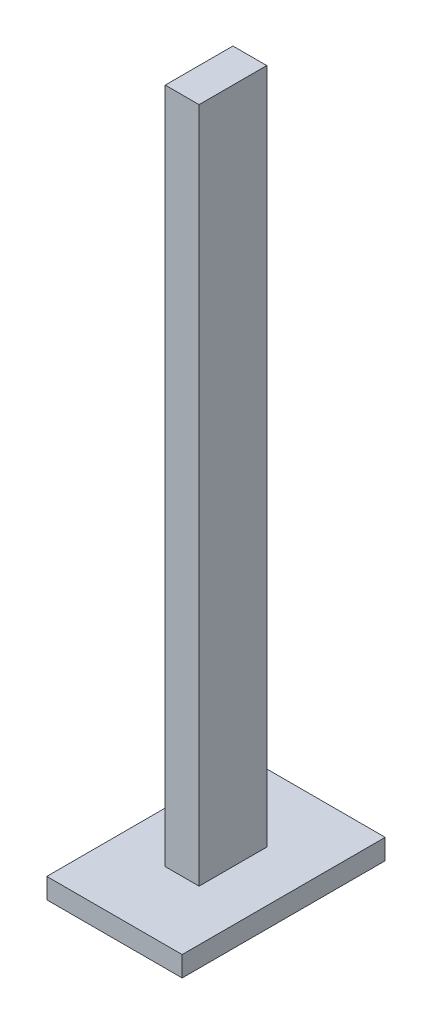
ISO-10303-21;
HEADER;
FILE_DESCRIPTION(('STEP AP214'),'2;1');
FILE_NAME('part.step','',(''),(''),'','','');
FILE_SCHEMA(('AUTOMOTIVE_DESIGN { 1 0 10303 214 1 1 1 1 }'));
ENDSEC;
DATA;
#1=APPLICATION_CONTEXT('core data for automotive mechanical design processes');
#2=APPLICATION_PROTOCOL_DEFINITION('international standard','automotive_design',2000,#1);
#3=PRODUCT_CONTEXT('',#1,'mechanical');
#4=PRODUCT('Part','Part','',(#3));
#5=PRODUCT_RELATED_PRODUCT_CATEGORY('part','',(#4));
#6=PRODUCT_DEFINITION_FORMATION('','',#4);
#7=PRODUCT_DEFINITION_CONTEXT('part definition',#1,'design');
#8=PRODUCT_DEFINITION('design','',#6,#7);
#9=PRODUCT_DEFINITION_SHAPE('','',#8);
#10=(LENGTH_UNIT() NAMED_UNIT(*) SI_UNIT(.MILLI.,.METRE.));
#11=(NAMED_UNIT(*) PLANE_ANGLE_UNIT() SI_UNIT($,.RADIAN.));
#12=(NAMED_UNIT(*) SI_UNIT($,.STERADIAN.) SOLID_ANGLE_UNIT());
#13=UNCERTAINTY_MEASURE_WITH_UNIT(LENGTH_MEASURE(1.E-05),#10,'distance_accuracy_value','');
#14=(GEOMETRIC_REPRESENTATION_CONTEXT(3) GLOBAL_UNCERTAINTY_ASSIGNED_CONTEXT((#13)) GLOBAL_UNIT_ASSIGNED_CONTEXT((#10,
#11,#12)) REPRESENTATION_CONTEXT('',''));
#15=CARTESIAN_POINT('',(0.,0.,0.));
#16=DIRECTION('',(0.,0.,1.));
#17=DIRECTION('',(1.,0.,0.));
#18=AXIS2_PLACEMENT_3D('',#15,#16,#17);
#19=CARTESIAN_POINT('',(0.,7.62,0.));
#20=DIRECTION('',(0.,-1.,0.));
#21=DIRECTION('',(0.,0.,-1.));
#22=AXIS2_PLACEMENT_3D('',#19,#20,#21);
#23=PLANE('',#22);
#24=DIRECTION('',(0.,0.,-1.));
#25=VECTOR('',#24,1.);
#26=CARTESIAN_POINT('',(25.4,7.62,38.1));
#27=LINE('',#26,#25);
#28=CARTESIAN_POINT('',(25.4,7.62,38.1));
#29=VERTEX_POINT('',#28);
#30=CARTESIAN_POINT('',(25.4,7.62,-38.1));
#31=VERTEX_POINT('',#30);
#32=EDGE_CURVE('E131',#29,#31,#27,.T.);
#33=ORIENTED_EDGE('',*,*,#32,.T.);
#34=DIRECTION('',(-1.,0.,0.));
#35=VECTOR('',#34,1.);
#36=CARTESIAN_POINT('',(-25.4,7.62,-38.1));
#37=LINE('',#36,#35);
#38=CARTESIAN_POINT('',(-25.4,7.62,-38.1));
#39=VERTEX_POINT('',#38);
#40=EDGE_CURVE('E134',#31,#39,#37,.T.);
#41=ORIENTED_EDGE('',*,*,#40,.T.);
#42=DIRECTION('',(0.,0.,1.));
#43=VECTOR('',#42,1.);
#44=CARTESIAN_POINT('',(-25.4,7.62,38.1));
#45=LINE('',#44,#43);
#46=CARTESIAN_POINT('',(-25.4,7.62,38.1));
#47=VERTEX_POINT('',#46);
#48=EDGE_CURVE('E137',#39,#47,#45,.T.);
#49=ORIENTED_EDGE('',*,*,#48,.T.);
#50=DIRECTION('',(1.,0.,0.));
#51=VECTOR('',#50,1.);
#52=CARTESIAN_POINT('',(-25.4,7.62,38.1));
#53=LINE('',#52,#51);
#54=EDGE_CURVE('E139',#47,#29,#53,.T.);
#55=ORIENTED_EDGE('',*,*,#54,.T.);
#56=EDGE_LOOP('',(#33,#41,#49,#55));
#57=FACE_BOUND('',#56,.T.);
#58=DIRECTION('',(0.,0.,-1.));
#59=VECTOR('',#58,1.);
#60=CARTESIAN_POINT('',(6.35,7.62,12.7));
#61=LINE('',#60,#59);
#62=CARTESIAN_POINT('',(6.35,7.62,12.7));
#63=VERTEX_POINT('',#62);
#64=CARTESIAN_POINT('',(6.35,7.62,-12.7));
#65=VERTEX_POINT('',#64);
#66=EDGE_CURVE('E121',#63,#65,#61,.T.);
#67=ORIENTED_EDGE('',*,*,#66,.F.);
#68=DIRECTION('',(1.,0.,0.));
#69=VECTOR('',#68,1.);
#70=CARTESIAN_POINT('',(-6.35,7.62,12.7));
#71=LINE('',#70,#69);
#72=CARTESIAN_POINT('',(-6.35,7.62,12.7));
#73=VERTEX_POINT('',#72);
#74=EDGE_CURVE('E118',#73,#63,#71,.T.);
#75=ORIENTED_EDGE('',*,*,#74,.F.);
#76=DIRECTION('',(0.,0.,1.));
#77=VECTOR('',#76,1.);
#78=CARTESIAN_POINT('',(-6.35,7.62,12.7));
#79=LINE('',#78,#77);
#80=CARTESIAN_POINT('',(-6.35,7.62,-12.7));
#81=VERTEX_POINT('',#80);
#82=EDGE_CURVE('E56',#81,#73,#79,.T.);
#83=ORIENTED_EDGE('',*,*,#82,.F.);
#84=DIRECTION('',(-1.,0.,0.));
#85=VECTOR('',#84,1.);
#86=CARTESIAN_POINT('',(-6.35,7.62,-12.7));
#87=LINE('',#86,#85);
#88=EDGE_CURVE('E51',#65,#81,#87,.T.);
#89=ORIENTED_EDGE('',*,*,#88,.F.);
#90=EDGE_LOOP('',(#67,#75,#83,#89));
#91=FACE_BOUND('',#90,.T.);
#92=ADVANCED_FACE('F36',(#57,#91),#23,.F.);
#93=CARTESIAN_POINT('',(25.4,7.62,38.1));
#94=DIRECTION('',(-1.,0.,0.));
#95=DIRECTION('',(0.,0.,1.));
#96=AXIS2_PLACEMENT_3D('',#93,#94,#95);
#97=PLANE('',#96);
#98=DIRECTION('',(0.,0.,-1.));
#99=VECTOR('',#98,1.);
#100=CARTESIAN_POINT('',(25.4,0.,38.1));
#101=LINE('',#100,#99);
#102=CARTESIAN_POINT('',(25.4,0.,38.1));
#103=VERTEX_POINT('',#102);
#104=CARTESIAN_POINT('',(25.4,0.,-38.1));
#105=VERTEX_POINT('',#104);
#106=EDGE_CURVE('E122',#103,#105,#101,.T.);
#107=ORIENTED_EDGE('',*,*,#106,.T.);
#108=DIRECTION('',(0.,-1.,0.));
#109=VECTOR('',#108,1.);
#110=CARTESIAN_POINT('',(25.4,7.62,-38.1));
#111=LINE('',#110,#109);
#112=EDGE_CURVE('E11',#31,#105,#111,.T.);
#113=ORIENTED_EDGE('',*,*,#112,.F.);
#114=ORIENTED_EDGE('',*,*,#32,.F.);
#115=DIRECTION('',(0.,-1.,0.));
#116=VECTOR('',#115,1.);
#117=CARTESIAN_POINT('',(25.4,7.62,38.1));
#118=LINE('',#117,#116);
#119=EDGE_CURVE('E140',#29,#103,#118,.T.);
#120=ORIENTED_EDGE('',*,*,#119,.T.);
#121=EDGE_LOOP('',(#107,#113,#114,#120));
#122=FACE_BOUND('',#121,.T.);
#123=ADVANCED_FACE('F38',(#122),#97,.F.);
#124=CARTESIAN_POINT('',(-25.4,7.62,-38.1));
#125=DIRECTION('',(0.,0.,1.));
#126=DIRECTION('',(1.,0.,0.));
#127=AXIS2_PLACEMENT_3D('',#124,#125,#126);
#128=PLANE('',#127);
#129=DIRECTION('',(-1.,0.,0.));
#130=VECTOR('',#129,1.);
#131=CARTESIAN_POINT('',(-25.4,0.,-38.1));
#132=LINE('',#131,#130);
#133=CARTESIAN_POINT('',(-25.4,0.,-38.1));
#134=VERTEX_POINT('',#133);
#135=EDGE_CURVE('E125',#105,#134,#132,.T.);
#136=ORIENTED_EDGE('',*,*,#135,.T.);
#137=DIRECTION('',(0.,-1.,0.));
#138=VECTOR('',#137,1.);
#139=CARTESIAN_POINT('',(-25.4,7.62,-38.1));
#140=LINE('',#139,#138);
#141=EDGE_CURVE('E44',#39,#134,#140,.T.);
#142=ORIENTED_EDGE('',*,*,#141,.F.);
#143=ORIENTED_EDGE('',*,*,#40,.F.);
#144=ORIENTED_EDGE('',*,*,#112,.T.);
#145=EDGE_LOOP('',(#136,#142,#143,#144));
#146=FACE_BOUND('',#145,.T.);
#147=ADVANCED_FACE('F170',(#146),#128,.F.);
#148=CARTESIAN_POINT('',(-25.4,7.62,38.1));
#149=DIRECTION('',(1.,0.,0.));
#150=DIRECTION('',(0.,0.,-1.));
#151=AXIS2_PLACEMENT_3D('',#148,#149,#150);
#152=PLANE('',#151);
#153=DIRECTION('',(0.,0.,1.));
#154=VECTOR('',#153,1.);
#155=CARTESIAN_POINT('',(-25.4,0.,38.1));
#156=LINE('',#155,#154);
#157=CARTESIAN_POINT('',(-25.4,0.,38.1));
#158=VERTEX_POINT('',#157);
#159=EDGE_CURVE('E143',#134,#158,#156,.T.);
#160=ORIENTED_EDGE('',*,*,#159,.T.);
#161=DIRECTION('',(0.,-1.,0.));
#162=VECTOR('',#161,1.);
#163=CARTESIAN_POINT('',(-25.4,7.62,38.1));
#164=LINE('',#163,#162);
#165=EDGE_CURVE('E148',#47,#158,#164,.T.);
#166=ORIENTED_EDGE('',*,*,#165,.F.);
#167=ORIENTED_EDGE('',*,*,#48,.F.);
#168=ORIENTED_EDGE('',*,*,#141,.T.);
#169=EDGE_LOOP('',(#160,#166,#167,#168));
#170=FACE_BOUND('',#169,.T.);
#171=ADVANCED_FACE('F155',(#170),#152,.F.);
#172=CARTESIAN_POINT('',(-25.4,7.62,38.1));
#173=DIRECTION('',(0.,0.,-1.));
#174=DIRECTION('',(-1.,0.,0.));
#175=AXIS2_PLACEMENT_3D('',#172,#173,#174);
#176=PLANE('',#175);
#177=DIRECTION('',(1.,0.,0.));
#178=VECTOR('',#177,1.);
#179=CARTESIAN_POINT('',(-25.4,0.,38.1));
#180=LINE('',#179,#178);
#181=EDGE_CURVE('E135',#158,#103,#180,.T.);
#182=ORIENTED_EDGE('',*,*,#181,.T.);
#183=ORIENTED_EDGE('',*,*,#119,.F.);
#184=ORIENTED_EDGE('',*,*,#54,.F.);
#185=ORIENTED_EDGE('',*,*,#165,.T.);
#186=EDGE_LOOP('',(#182,#183,#184,#185));
#187=FACE_BOUND('',#186,.T.);
#188=ADVANCED_FACE('F164',(#187),#176,.F.);
#189=CARTESIAN_POINT('',(0.,0.,0.));
#190=DIRECTION('',(0.,-1.,0.));
#191=DIRECTION('',(0.,0.,-1.));
#192=AXIS2_PLACEMENT_3D('',#189,#190,#191);
#193=PLANE('',#192);
#194=ORIENTED_EDGE('',*,*,#106,.F.);
#195=ORIENTED_EDGE('',*,*,#181,.F.);
#196=ORIENTED_EDGE('',*,*,#159,.F.);
#197=ORIENTED_EDGE('',*,*,#135,.F.);
#198=EDGE_LOOP('',(#194,#195,#196,#197));
#199=FACE_BOUND('',#198,.T.);
#200=ADVANCED_FACE('F161',(#199),#193,.T.);
#201=CARTESIAN_POINT('',(6.35,261.62,12.7));
#202=DIRECTION('',(-1.,0.,0.));
#203=DIRECTION('',(0.,0.,1.));
#204=AXIS2_PLACEMENT_3D('',#201,#202,#203);
#205=PLANE('',#204);
#206=ORIENTED_EDGE('',*,*,#66,.T.);
#207=DIRECTION('',(0.,-1.,0.));
#208=VECTOR('',#207,1.);
#209=CARTESIAN_POINT('',(6.35,261.62,-12.7));
#210=LINE('',#209,#208);
#211=CARTESIAN_POINT('',(6.35,261.62,-12.7));
#212=VERTEX_POINT('',#211);
#213=EDGE_CURVE('E102',#212,#65,#210,.T.);
#214=ORIENTED_EDGE('',*,*,#213,.F.);
#215=DIRECTION('',(0.,0.,-1.));
#216=VECTOR('',#215,1.);
#217=CARTESIAN_POINT('',(6.35,261.62,12.7));
#218=LINE('',#217,#216);
#219=CARTESIAN_POINT('',(6.35,261.62,12.7));
#220=VERTEX_POINT('',#219);
#221=EDGE_CURVE('E109',#220,#212,#218,.T.);
#222=ORIENTED_EDGE('',*,*,#221,.F.);
#223=DIRECTION('',(0.,-1.,0.));
#224=VECTOR('',#223,1.);
#225=CARTESIAN_POINT('',(6.35,261.62,12.7));
#226=LINE('',#225,#224);
#227=EDGE_CURVE('E265',#220,#63,#226,.T.);
#228=ORIENTED_EDGE('',*,*,#227,.T.);
#229=EDGE_LOOP('',(#206,#214,#222,#228));
#230=FACE_BOUND('',#229,.T.);
#231=ADVANCED_FACE('F120',(#230),#205,.F.);
#232=CARTESIAN_POINT('',(-6.35,261.62,-12.7));
#233=DIRECTION('',(0.,0.,1.));
#234=DIRECTION('',(1.,0.,0.));
#235=AXIS2_PLACEMENT_3D('',#232,#233,#234);
#236=PLANE('',#235);
#237=ORIENTED_EDGE('',*,*,#88,.T.);
#238=DIRECTION('',(0.,-1.,0.));
#239=VECTOR('',#238,1.);
#240=CARTESIAN_POINT('',(-6.35,261.62,-12.7));
#241=LINE('',#240,#239);
#242=CARTESIAN_POINT('',(-6.35,261.62,-12.7));
#243=VERTEX_POINT('',#242);
#244=EDGE_CURVE('E105',#243,#81,#241,.T.);
#245=ORIENTED_EDGE('',*,*,#244,.F.);
#246=DIRECTION('',(-1.,0.,0.));
#247=VECTOR('',#246,1.);
#248=CARTESIAN_POINT('',(-6.35,261.62,-12.7));
#249=LINE('',#248,#247);
#250=EDGE_CURVE('E98',#212,#243,#249,.T.);
#251=ORIENTED_EDGE('',*,*,#250,.F.);
#252=ORIENTED_EDGE('',*,*,#213,.T.);
#253=EDGE_LOOP('',(#237,#245,#251,#252));
#254=FACE_BOUND('',#253,.T.);
#255=ADVANCED_FACE('F100',(#254),#236,.F.);
#256=CARTESIAN_POINT('',(-6.35,261.62,12.7));
#257=DIRECTION('',(1.,0.,0.));
#258=DIRECTION('',(0.,0.,-1.));
#259=AXIS2_PLACEMENT_3D('',#256,#257,#258);
#260=PLANE('',#259);
#261=ORIENTED_EDGE('',*,*,#82,.T.);
#262=DIRECTION('',(0.,-1.,0.));
#263=VECTOR('',#262,1.);
#264=CARTESIAN_POINT('',(-6.35,261.62,12.7));
#265=LINE('',#264,#263);
#266=CARTESIAN_POINT('',(-6.35,261.62,12.7));
#267=VERTEX_POINT('',#266);
#268=EDGE_CURVE('E127',#267,#73,#265,.T.);
#269=ORIENTED_EDGE('',*,*,#268,.F.);
#270=DIRECTION('',(0.,0.,1.));
#271=VECTOR('',#270,1.);
#272=CARTESIAN_POINT('',(-6.35,261.62,12.7));
#273=LINE('',#272,#271);
#274=EDGE_CURVE('E108',#243,#267,#273,.T.);
#275=ORIENTED_EDGE('',*,*,#274,.F.);
#276=ORIENTED_EDGE('',*,*,#244,.T.);
#277=EDGE_LOOP('',(#261,#269,#275,#276));
#278=FACE_BOUND('',#277,.T.);
#279=ADVANCED_FACE('F207',(#278),#260,.F.);
#280=CARTESIAN_POINT('',(-6.35,261.62,12.7));
#281=DIRECTION('',(0.,0.,-1.));
#282=DIRECTION('',(-1.,0.,0.));
#283=AXIS2_PLACEMENT_3D('',#280,#281,#282);
#284=PLANE('',#283);
#285=ORIENTED_EDGE('',*,*,#74,.T.);
#286=ORIENTED_EDGE('',*,*,#227,.F.);
#287=DIRECTION('',(1.,0.,0.));
#288=VECTOR('',#287,1.);
#289=CARTESIAN_POINT('',(-6.35,261.62,12.7));
#290=LINE('',#289,#288);
#291=EDGE_CURVE('E114',#267,#220,#290,.T.);
#292=ORIENTED_EDGE('',*,*,#291,.F.);
#293=ORIENTED_EDGE('',*,*,#268,.T.);
#294=EDGE_LOOP('',(#285,#286,#292,#293));
#295=FACE_BOUND('',#294,.T.);
#296=ADVANCED_FACE('F213',(#295),#284,.F.);
#297=CARTESIAN_POINT('',(0.,261.62,0.));
#298=DIRECTION('',(0.,-1.,0.));
#299=DIRECTION('',(0.,0.,-1.));
#300=AXIS2_PLACEMENT_3D('',#297,#298,#299);
#301=PLANE('',#300);
#302=ORIENTED_EDGE('',*,*,#221,.T.);
#303=ORIENTED_EDGE('',*,*,#250,.T.);
#304=ORIENTED_EDGE('',*,*,#274,.T.);
#305=ORIENTED_EDGE('',*,*,#291,.T.);
#306=EDGE_LOOP('',(#302,#303,#304,#305));
#307=FACE_BOUND('',#306,.T.);
#308=ADVANCED_FACE('F112',(#307),#301,.F.);
#309=CLOSED_SHELL('',(#92,#123,#147,#171,#188,#200,#231,#255,#279,#296,#308));
#310=MANIFOLD_SOLID_BREP('B2',#309);
#311=ADVANCED_BREP_SHAPE_REPRESENTATION('',(#18,#310),#14);
#312=SHAPE_DEFINITION_REPRESENTATION(#9,#311);
ENDSEC;
END-ISO-10303-21;
